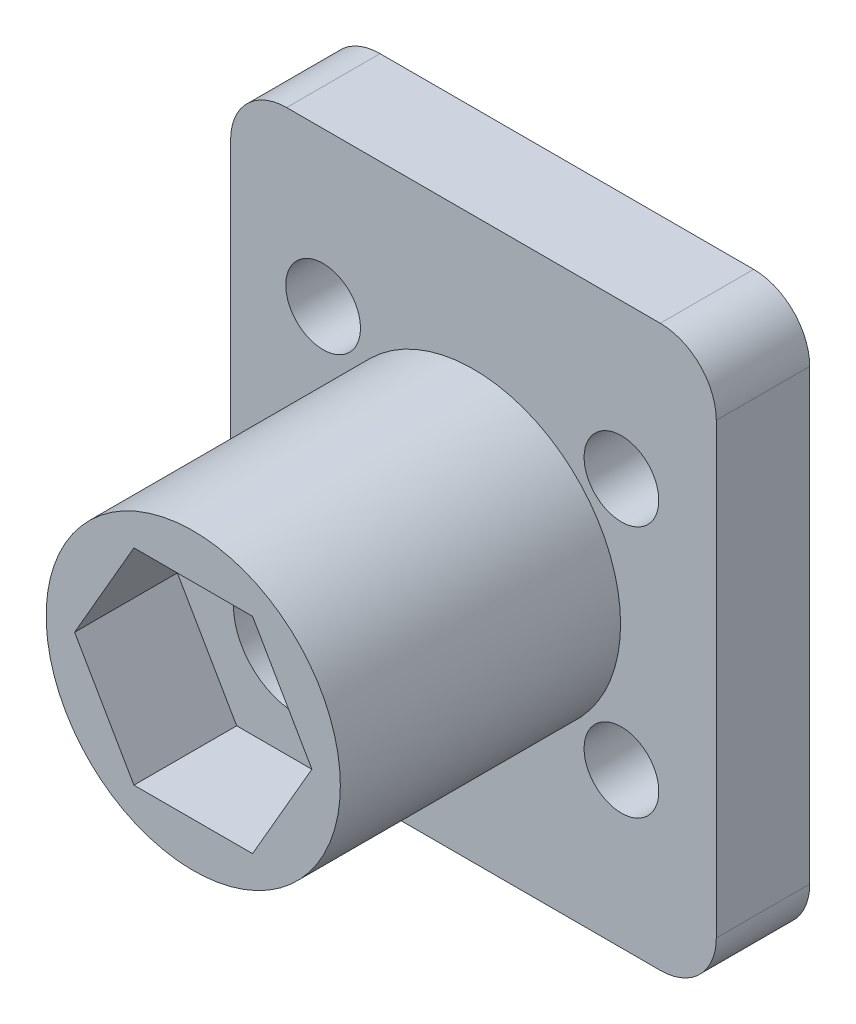
ISO-10303-21;
HEADER;
FILE_DESCRIPTION(('STEP AP214'),'2;1');
FILE_NAME('part.step','',(''),(''),'','','');
FILE_SCHEMA(('AUTOMOTIVE_DESIGN { 1 0 10303 214 1 1 1 1 }'));
ENDSEC;
DATA;
#1=APPLICATION_CONTEXT('core data for automotive mechanical design processes');
#2=APPLICATION_PROTOCOL_DEFINITION('international standard','automotive_design',2000,#1);
#3=PRODUCT_CONTEXT('',#1,'mechanical');
#4=PRODUCT('Part','Part','',(#3));
#5=PRODUCT_RELATED_PRODUCT_CATEGORY('part','',(#4));
#6=PRODUCT_DEFINITION_FORMATION('','',#4);
#7=PRODUCT_DEFINITION_CONTEXT('part definition',#1,'design');
#8=PRODUCT_DEFINITION('design','',#6,#7);
#9=PRODUCT_DEFINITION_SHAPE('','',#8);
#10=(LENGTH_UNIT() NAMED_UNIT(*) SI_UNIT(.MILLI.,.METRE.));
#11=(NAMED_UNIT(*) PLANE_ANGLE_UNIT() SI_UNIT($,.RADIAN.));
#12=(NAMED_UNIT(*) SI_UNIT($,.STERADIAN.) SOLID_ANGLE_UNIT());
#13=UNCERTAINTY_MEASURE_WITH_UNIT(LENGTH_MEASURE(1.E-05),#10,'distance_accuracy_value','');
#14=(GEOMETRIC_REPRESENTATION_CONTEXT(3) GLOBAL_UNCERTAINTY_ASSIGNED_CONTEXT((#13)) GLOBAL_UNIT_ASSIGNED_CONTEXT((#10,
#11,#12)) REPRESENTATION_CONTEXT('',''));
#15=CARTESIAN_POINT('',(0.,0.,0.));
#16=DIRECTION('',(0.,0.,1.));
#17=DIRECTION('',(1.,0.,0.));
#18=AXIS2_PLACEMENT_3D('',#15,#16,#17);
#19=CARTESIAN_POINT('',(0.,0.,15.));
#20=DIRECTION('',(0.,0.,1.));
#21=DIRECTION('',(1.,0.,0.));
#22=AXIS2_PLACEMENT_3D('',#19,#20,#21);
#23=PLANE('',#22);
#24=CARTESIAN_POINT('',(0.,0.,15.));
#25=DIRECTION('',(0.,0.,1.));
#26=DIRECTION('',(1.,0.,0.));
#27=AXIS2_PLACEMENT_3D('',#24,#25,#26);
#28=CIRCLE('',#27,7.875);
#29=CARTESIAN_POINT('',(7.875,0.,15.));
#30=VERTEX_POINT('',#29);
#31=EDGE_CURVE('E222',#30,#30,#28,.T.);
#32=ORIENTED_EDGE('',*,*,#31,.T.);
#33=EDGE_LOOP('',(#32));
#34=FACE_BOUND('',#33,.T.);
#35=DIRECTION('',(-0.500000000000001,0.866025403784438,0.));
#36=VECTOR('',#35,1.);
#37=CARTESIAN_POINT('',(6.35085296108589,0.,15.));
#38=LINE('',#37,#36);
#39=CARTESIAN_POINT('',(6.35085296108589,0.,15.));
#40=VERTEX_POINT('',#39);
#41=CARTESIAN_POINT('',(3.17542648054293,5.50000000000001,15.));
#42=VERTEX_POINT('',#41);
#43=EDGE_CURVE('E201',#40,#42,#38,.T.);
#44=ORIENTED_EDGE('',*,*,#43,.F.);
#45=DIRECTION('',(0.499999999999995,0.866025403784441,0.));
#46=VECTOR('',#45,1.);
#47=CARTESIAN_POINT('',(3.17542648054301,-5.49999999999997,15.));
#48=LINE('',#47,#46);
#49=CARTESIAN_POINT('',(3.17542648054301,-5.49999999999997,15.));
#50=VERTEX_POINT('',#49);
#51=EDGE_CURVE('E199',#50,#40,#48,.T.);
#52=ORIENTED_EDGE('',*,*,#51,.F.);
#53=DIRECTION('',(1.,0.,0.));
#54=VECTOR('',#53,1.);
#55=CARTESIAN_POINT('',(-3.17542648054289,-5.50000000000003,15.));
#56=LINE('',#55,#54);
#57=CARTESIAN_POINT('',(-3.17542648054289,-5.50000000000003,15.));
#58=VERTEX_POINT('',#57);
#59=EDGE_CURVE('E146',#58,#50,#56,.T.);
#60=ORIENTED_EDGE('',*,*,#59,.F.);
#61=DIRECTION('',(0.500000000000007,-0.866025403784435,0.));
#62=VECTOR('',#61,1.);
#63=CARTESIAN_POINT('',(-6.35085296108589,0.,15.));
#64=LINE('',#63,#62);
#65=CARTESIAN_POINT('',(-6.35085296108589,0.,15.));
#66=VERTEX_POINT('',#65);
#67=EDGE_CURVE('E207',#66,#58,#64,.T.);
#68=ORIENTED_EDGE('',*,*,#67,.F.);
#69=DIRECTION('',(-0.499999999999995,-0.866025403784441,0.));
#70=VECTOR('',#69,1.);
#71=CARTESIAN_POINT('',(-3.17542648054297,5.49999999999999,15.));
#72=LINE('',#71,#70);
#73=CARTESIAN_POINT('',(-3.17542648054297,5.49999999999999,15.));
#74=VERTEX_POINT('',#73);
#75=EDGE_CURVE('E205',#74,#66,#72,.T.);
#76=ORIENTED_EDGE('',*,*,#75,.F.);
#77=DIRECTION('',(-1.,0.,0.));
#78=VECTOR('',#77,1.);
#79=CARTESIAN_POINT('',(3.17542648054293,5.50000000000001,15.));
#80=LINE('',#79,#78);
#81=EDGE_CURVE('E203',#42,#74,#80,.T.);
#82=ORIENTED_EDGE('',*,*,#81,.F.);
#83=EDGE_LOOP('',(#44,#52,#60,#68,#76,#82));
#84=FACE_BOUND('',#83,.T.);
#85=ADVANCED_FACE('F39',(#34,#84),#23,.T.);
#86=CARTESIAN_POINT('',(0.,0.,15.));
#87=DIRECTION('',(0.,0.,-1.));
#88=DIRECTION('',(-1.,0.,0.));
#89=AXIS2_PLACEMENT_3D('',#86,#87,#88);
#90=CYLINDRICAL_SURFACE('',#89,7.875);
#91=ORIENTED_EDGE('',*,*,#31,.F.);
#92=EDGE_LOOP('',(#91));
#93=FACE_BOUND('',#92,.T.);
#94=CARTESIAN_POINT('',(0.,0.,0.));
#95=DIRECTION('',(0.,0.,1.));
#96=DIRECTION('',(1.,0.,0.));
#97=AXIS2_PLACEMENT_3D('',#94,#95,#96);
#98=CIRCLE('',#97,7.875);
#99=CARTESIAN_POINT('',(7.875,0.,0.));
#100=VERTEX_POINT('',#99);
#101=EDGE_CURVE('E189',#100,#100,#98,.T.);
#102=ORIENTED_EDGE('',*,*,#101,.T.);
#103=EDGE_LOOP('',(#102));
#104=FACE_BOUND('',#103,.T.);
#105=ADVANCED_FACE('F310',(#93,#104),#90,.T.);
#106=CARTESIAN_POINT('',(3.17542648054301,-5.49999999999997,15.));
#107=DIRECTION('',(-0.866025403784441,0.499999999999995,0.));
#108=DIRECTION('',(-0.499999999999995,-0.866025403784441,0.));
#109=AXIS2_PLACEMENT_3D('',#106,#107,#108);
#110=PLANE('',#109);
#111=DIRECTION('',(0.499999999999995,0.866025403784442,0.));
#112=VECTOR('',#111,1.);
#113=CARTESIAN_POINT('',(3.17542648054301,-5.49999999999997,9.5));
#114=LINE('',#113,#112);
#115=CARTESIAN_POINT('',(3.17542648054301,-5.49999999999997,9.5));
#116=VERTEX_POINT('',#115);
#117=CARTESIAN_POINT('',(6.35085296108589,0.,9.5));
#118=VERTEX_POINT('',#117);
#119=EDGE_CURVE('E153',#116,#118,#114,.T.);
#120=ORIENTED_EDGE('',*,*,#119,.F.);
#121=DIRECTION('',(0.,0.,-1.));
#122=VECTOR('',#121,1.);
#123=CARTESIAN_POINT('',(3.17542648054301,-5.49999999999997,15.));
#124=LINE('',#123,#122);
#125=EDGE_CURVE('E139',#50,#116,#124,.T.);
#126=ORIENTED_EDGE('',*,*,#125,.F.);
#127=ORIENTED_EDGE('',*,*,#51,.T.);
#128=DIRECTION('',(0.,0.,-1.));
#129=VECTOR('',#128,1.);
#130=CARTESIAN_POINT('',(6.35085296108589,0.,15.));
#131=LINE('',#130,#129);
#132=EDGE_CURVE('E156',#40,#118,#131,.T.);
#133=ORIENTED_EDGE('',*,*,#132,.T.);
#134=EDGE_LOOP('',(#120,#126,#127,#133));
#135=FACE_BOUND('',#134,.T.);
#136=ADVANCED_FACE('F154',(#135),#110,.T.);
#137=CARTESIAN_POINT('',(6.35085296108589,0.,15.));
#138=DIRECTION('',(-0.866025403784438,-0.500000000000001,0.));
#139=DIRECTION('',(0.500000000000001,-0.866025403784438,0.));
#140=AXIS2_PLACEMENT_3D('',#137,#138,#139);
#141=PLANE('',#140);
#142=DIRECTION('',(-0.500000000000001,0.866025403784438,0.));
#143=VECTOR('',#142,1.);
#144=CARTESIAN_POINT('',(6.35085296108589,0.,9.5));
#145=LINE('',#144,#143);
#146=CARTESIAN_POINT('',(3.17542648054293,5.50000000000001,9.5));
#147=VERTEX_POINT('',#146);
#148=EDGE_CURVE('E159',#118,#147,#145,.T.);
#149=ORIENTED_EDGE('',*,*,#148,.F.);
#150=ORIENTED_EDGE('',*,*,#132,.F.);
#151=ORIENTED_EDGE('',*,*,#43,.T.);
#152=DIRECTION('',(0.,0.,-1.));
#153=VECTOR('',#152,1.);
#154=CARTESIAN_POINT('',(3.17542648054293,5.50000000000001,15.));
#155=LINE('',#154,#153);
#156=EDGE_CURVE('E218',#42,#147,#155,.T.);
#157=ORIENTED_EDGE('',*,*,#156,.T.);
#158=EDGE_LOOP('',(#149,#150,#151,#157));
#159=FACE_BOUND('',#158,.T.);
#160=ADVANCED_FACE('F444',(#159),#141,.T.);
#161=CARTESIAN_POINT('',(3.17542648054293,5.50000000000001,15.));
#162=DIRECTION('',(0.,-1.,0.));
#163=DIRECTION('',(1.,0.,0.));
#164=AXIS2_PLACEMENT_3D('',#161,#162,#163);
#165=PLANE('',#164);
#166=DIRECTION('',(-1.,0.,0.));
#167=VECTOR('',#166,1.);
#168=CARTESIAN_POINT('',(3.17542648054293,5.50000000000001,9.5));
#169=LINE('',#168,#167);
#170=CARTESIAN_POINT('',(-3.17542648054297,5.49999999999999,9.5));
#171=VERTEX_POINT('',#170);
#172=EDGE_CURVE('E172',#147,#171,#169,.T.);
#173=ORIENTED_EDGE('',*,*,#172,.F.);
#174=ORIENTED_EDGE('',*,*,#156,.F.);
#175=ORIENTED_EDGE('',*,*,#81,.T.);
#176=DIRECTION('',(0.,0.,-1.));
#177=VECTOR('',#176,1.);
#178=CARTESIAN_POINT('',(-3.17542648054297,5.49999999999999,15.));
#179=LINE('',#178,#177);
#180=EDGE_CURVE('E215',#74,#171,#179,.T.);
#181=ORIENTED_EDGE('',*,*,#180,.T.);
#182=EDGE_LOOP('',(#173,#174,#175,#181));
#183=FACE_BOUND('',#182,.T.);
#184=ADVANCED_FACE('F434',(#183),#165,.T.);
#185=CARTESIAN_POINT('',(-3.17542648054297,5.49999999999999,15.));
#186=DIRECTION('',(0.866025403784441,-0.499999999999995,0.));
#187=DIRECTION('',(0.499999999999995,0.866025403784442,0.));
#188=AXIS2_PLACEMENT_3D('',#185,#186,#187);
#189=PLANE('',#188);
#190=DIRECTION('',(-0.499999999999995,-0.866025403784441,0.));
#191=VECTOR('',#190,1.);
#192=CARTESIAN_POINT('',(-3.17542648054297,5.49999999999999,9.5));
#193=LINE('',#192,#191);
#194=CARTESIAN_POINT('',(-6.35085296108589,0.,9.5));
#195=VERTEX_POINT('',#194);
#196=EDGE_CURVE('E175',#171,#195,#193,.T.);
#197=ORIENTED_EDGE('',*,*,#196,.F.);
#198=ORIENTED_EDGE('',*,*,#180,.F.);
#199=ORIENTED_EDGE('',*,*,#75,.T.);
#200=DIRECTION('',(0.,0.,-1.));
#201=VECTOR('',#200,1.);
#202=CARTESIAN_POINT('',(-6.35085296108589,0.,15.));
#203=LINE('',#202,#201);
#204=EDGE_CURVE('E212',#66,#195,#203,.T.);
#205=ORIENTED_EDGE('',*,*,#204,.T.);
#206=EDGE_LOOP('',(#197,#198,#199,#205));
#207=FACE_BOUND('',#206,.T.);
#208=ADVANCED_FACE('F424',(#207),#189,.T.);
#209=CARTESIAN_POINT('',(-6.35085296108589,0.,15.));
#210=DIRECTION('',(0.866025403784435,0.500000000000007,0.));
#211=DIRECTION('',(-0.500000000000007,0.866025403784435,0.));
#212=AXIS2_PLACEMENT_3D('',#209,#210,#211);
#213=PLANE('',#212);
#214=DIRECTION('',(0.500000000000007,-0.866025403784435,0.));
#215=VECTOR('',#214,1.);
#216=CARTESIAN_POINT('',(-6.35085296108589,0.,9.5));
#217=LINE('',#216,#215);
#218=CARTESIAN_POINT('',(-3.17542648054289,-5.50000000000003,9.5));
#219=VERTEX_POINT('',#218);
#220=EDGE_CURVE('E165',#195,#219,#217,.T.);
#221=ORIENTED_EDGE('',*,*,#220,.F.);
#222=ORIENTED_EDGE('',*,*,#204,.F.);
#223=ORIENTED_EDGE('',*,*,#67,.T.);
#224=DIRECTION('',(0.,0.,-1.));
#225=VECTOR('',#224,1.);
#226=CARTESIAN_POINT('',(-3.17542648054289,-5.50000000000003,15.));
#227=LINE('',#226,#225);
#228=EDGE_CURVE('E149',#58,#219,#227,.T.);
#229=ORIENTED_EDGE('',*,*,#228,.T.);
#230=EDGE_LOOP('',(#221,#222,#223,#229));
#231=FACE_BOUND('',#230,.T.);
#232=ADVANCED_FACE('F413',(#231),#213,.T.);
#233=CARTESIAN_POINT('',(-3.17542648054289,-5.50000000000003,15.));
#234=DIRECTION('',(0.,1.,0.));
#235=DIRECTION('',(-1.,0.,0.));
#236=AXIS2_PLACEMENT_3D('',#233,#234,#235);
#237=PLANE('',#236);
#238=DIRECTION('',(1.,0.,0.));
#239=VECTOR('',#238,1.);
#240=CARTESIAN_POINT('',(-3.17542648054289,-5.50000000000003,9.5));
#241=LINE('',#240,#239);
#242=EDGE_CURVE('E143',#219,#116,#241,.T.);
#243=ORIENTED_EDGE('',*,*,#242,.F.);
#244=ORIENTED_EDGE('',*,*,#228,.F.);
#245=ORIENTED_EDGE('',*,*,#59,.T.);
#246=ORIENTED_EDGE('',*,*,#125,.T.);
#247=EDGE_LOOP('',(#243,#244,#245,#246));
#248=FACE_BOUND('',#247,.T.);
#249=ADVANCED_FACE('F141',(#248),#237,.T.);
#250=CARTESIAN_POINT('',(-13.,15.,-5.));
#251=DIRECTION('',(1.,0.,0.));
#252=DIRECTION('',(0.,0.,-1.));
#253=AXIS2_PLACEMENT_3D('',#250,#251,#252);
#254=PLANE('',#253);
#255=DIRECTION('',(0.,1.,0.));
#256=VECTOR('',#255,1.);
#257=CARTESIAN_POINT('',(-13.,15.,-5.));
#258=LINE('',#257,#256);
#259=CARTESIAN_POINT('',(-13.,-12.,-5.));
#260=VERTEX_POINT('',#259);
#261=CARTESIAN_POINT('',(-13.,12.,-5.));
#262=VERTEX_POINT('',#261);
#263=EDGE_CURVE('E178',#260,#262,#258,.T.);
#264=ORIENTED_EDGE('',*,*,#263,.F.);
#265=DIRECTION('',(0.,0.,1.));
#266=VECTOR('',#265,1.);
#267=CARTESIAN_POINT('',(-13.,-12.,-5.));
#268=LINE('',#267,#266);
#269=CARTESIAN_POINT('',(-13.,-12.,0.));
#270=VERTEX_POINT('',#269);
#271=EDGE_CURVE('E268',#260,#270,#268,.T.);
#272=ORIENTED_EDGE('',*,*,#271,.T.);
#273=DIRECTION('',(0.,1.,0.));
#274=VECTOR('',#273,1.);
#275=CARTESIAN_POINT('',(-13.,15.,0.));
#276=LINE('',#275,#274);
#277=CARTESIAN_POINT('',(-13.,12.,0.));
#278=VERTEX_POINT('',#277);
#279=EDGE_CURVE('E177',#270,#278,#276,.T.);
#280=ORIENTED_EDGE('',*,*,#279,.T.);
#281=DIRECTION('',(0.,0.,1.));
#282=VECTOR('',#281,1.);
#283=CARTESIAN_POINT('',(-13.,12.,-5.));
#284=LINE('',#283,#282);
#285=EDGE_CURVE('E266',#278,#262,#284,.F.);
#286=ORIENTED_EDGE('',*,*,#285,.T.);
#287=EDGE_LOOP('',(#264,#272,#280,#286));
#288=FACE_BOUND('',#287,.T.);
#289=ADVANCED_FACE('F285',(#288),#254,.F.);
#290=CARTESIAN_POINT('',(13.,15.,-5.));
#291=DIRECTION('',(0.,-1.,0.));
#292=DIRECTION('',(0.,0.,-1.));
#293=AXIS2_PLACEMENT_3D('',#290,#291,#292);
#294=PLANE('',#293);
#295=DIRECTION('',(1.,0.,0.));
#296=VECTOR('',#295,1.);
#297=CARTESIAN_POINT('',(13.,15.,0.));
#298=LINE('',#297,#296);
#299=CARTESIAN_POINT('',(-9.99999999999999,15.,0.));
#300=VERTEX_POINT('',#299);
#301=CARTESIAN_POINT('',(10.,15.,0.));
#302=VERTEX_POINT('',#301);
#303=EDGE_CURVE('E192',#300,#302,#298,.T.);
#304=ORIENTED_EDGE('',*,*,#303,.T.);
#305=DIRECTION('',(0.,0.,1.));
#306=VECTOR('',#305,1.);
#307=CARTESIAN_POINT('',(10.,15.,-5.));
#308=LINE('',#307,#306);
#309=CARTESIAN_POINT('',(10.,15.,-5.));
#310=VERTEX_POINT('',#309);
#311=EDGE_CURVE('E257',#302,#310,#308,.F.);
#312=ORIENTED_EDGE('',*,*,#311,.T.);
#313=DIRECTION('',(1.,0.,0.));
#314=VECTOR('',#313,1.);
#315=CARTESIAN_POINT('',(13.,15.,-5.));
#316=LINE('',#315,#314);
#317=CARTESIAN_POINT('',(-9.99999999999999,15.,-5.));
#318=VERTEX_POINT('',#317);
#319=EDGE_CURVE('E181',#318,#310,#316,.T.);
#320=ORIENTED_EDGE('',*,*,#319,.F.);
#321=DIRECTION('',(0.,0.,1.));
#322=VECTOR('',#321,1.);
#323=CARTESIAN_POINT('',(-10.,15.,-5.));
#324=LINE('',#323,#322);
#325=EDGE_CURVE('E254',#318,#300,#324,.T.);
#326=ORIENTED_EDGE('',*,*,#325,.T.);
#327=EDGE_LOOP('',(#304,#312,#320,#326));
#328=FACE_BOUND('',#327,.T.);
#329=ADVANCED_FACE('F295',(#328),#294,.F.);
#330=CARTESIAN_POINT('',(13.,15.,-5.));
#331=DIRECTION('',(-1.,0.,0.));
#332=DIRECTION('',(0.,0.,1.));
#333=AXIS2_PLACEMENT_3D('',#330,#331,#332);
#334=PLANE('',#333);
#335=DIRECTION('',(0.,-1.,0.));
#336=VECTOR('',#335,1.);
#337=CARTESIAN_POINT('',(13.,15.,-5.));
#338=LINE('',#337,#336);
#339=CARTESIAN_POINT('',(13.,12.,-5.));
#340=VERTEX_POINT('',#339);
#341=CARTESIAN_POINT('',(13.,-12.,-5.));
#342=VERTEX_POINT('',#341);
#343=EDGE_CURVE('E185',#340,#342,#338,.T.);
#344=ORIENTED_EDGE('',*,*,#343,.F.);
#345=DIRECTION('',(0.,0.,1.));
#346=VECTOR('',#345,1.);
#347=CARTESIAN_POINT('',(13.,12.,-5.));
#348=LINE('',#347,#346);
#349=CARTESIAN_POINT('',(13.,12.,0.));
#350=VERTEX_POINT('',#349);
#351=EDGE_CURVE('E243',#340,#350,#348,.T.);
#352=ORIENTED_EDGE('',*,*,#351,.T.);
#353=DIRECTION('',(0.,-1.,0.));
#354=VECTOR('',#353,1.);
#355=CARTESIAN_POINT('',(13.,15.,0.));
#356=LINE('',#355,#354);
#357=CARTESIAN_POINT('',(13.,-12.,0.));
#358=VERTEX_POINT('',#357);
#359=EDGE_CURVE('E195',#350,#358,#356,.T.);
#360=ORIENTED_EDGE('',*,*,#359,.T.);
#361=DIRECTION('',(0.,0.,1.));
#362=VECTOR('',#361,1.);
#363=CARTESIAN_POINT('',(13.,-12.,-5.));
#364=LINE('',#363,#362);
#365=EDGE_CURVE('E225',#358,#342,#364,.F.);
#366=ORIENTED_EDGE('',*,*,#365,.T.);
#367=EDGE_LOOP('',(#344,#352,#360,#366));
#368=FACE_BOUND('',#367,.T.);
#369=ADVANCED_FACE('F303',(#368),#334,.F.);
#370=CARTESIAN_POINT('',(13.,-15.,-5.));
#371=DIRECTION('',(0.,1.,0.));
#372=DIRECTION('',(-1.,0.,0.));
#373=AXIS2_PLACEMENT_3D('',#370,#371,#372);
#374=PLANE('',#373);
#375=DIRECTION('',(-1.,0.,0.));
#376=VECTOR('',#375,1.);
#377=CARTESIAN_POINT('',(13.,-15.,0.));
#378=LINE('',#377,#376);
#379=CARTESIAN_POINT('',(10.,-15.,0.));
#380=VERTEX_POINT('',#379);
#381=CARTESIAN_POINT('',(-9.99999999999999,-15.,0.));
#382=VERTEX_POINT('',#381);
#383=EDGE_CURVE('E182',#380,#382,#378,.T.);
#384=ORIENTED_EDGE('',*,*,#383,.T.);
#385=DIRECTION('',(0.,0.,1.));
#386=VECTOR('',#385,1.);
#387=CARTESIAN_POINT('',(-10.,-15.,-5.));
#388=LINE('',#387,#386);
#389=CARTESIAN_POINT('',(-9.99999999999999,-15.,-5.));
#390=VERTEX_POINT('',#389);
#391=EDGE_CURVE('E11',#382,#390,#388,.F.);
#392=ORIENTED_EDGE('',*,*,#391,.T.);
#393=DIRECTION('',(-1.,0.,0.));
#394=VECTOR('',#393,1.);
#395=CARTESIAN_POINT('',(13.,-15.,-5.));
#396=LINE('',#395,#394);
#397=CARTESIAN_POINT('',(10.,-15.,-5.));
#398=VERTEX_POINT('',#397);
#399=EDGE_CURVE('E187',#398,#390,#396,.T.);
#400=ORIENTED_EDGE('',*,*,#399,.F.);
#401=DIRECTION('',(0.,0.,1.));
#402=VECTOR('',#401,1.);
#403=CARTESIAN_POINT('',(10.,-15.,-5.));
#404=LINE('',#403,#402);
#405=EDGE_CURVE('E47',#398,#380,#404,.T.);
#406=ORIENTED_EDGE('',*,*,#405,.T.);
#407=EDGE_LOOP('',(#384,#392,#400,#406));
#408=FACE_BOUND('',#407,.T.);
#409=ADVANCED_FACE('F273',(#408),#374,.F.);
#410=CARTESIAN_POINT('',(0.,0.,-5.));
#411=DIRECTION('',(0.,0.,-1.));
#412=DIRECTION('',(-1.,0.,0.));
#413=AXIS2_PLACEMENT_3D('',#410,#411,#412);
#414=PLANE('',#413);
#415=CARTESIAN_POINT('',(-8.04749109633995,6.75,-5.));
#416=DIRECTION('',(0.,0.,-1.));
#417=DIRECTION('',(-1.,0.,0.));
#418=AXIS2_PLACEMENT_3D('',#415,#416,#417);
#419=CIRCLE('',#418,2.);
#420=CARTESIAN_POINT('',(-10.04749109634,6.75,-5.));
#421=VERTEX_POINT('',#420);
#422=EDGE_CURVE('E491',#421,#421,#419,.T.);
#423=ORIENTED_EDGE('',*,*,#422,.F.);
#424=EDGE_LOOP('',(#423));
#425=FACE_BOUND('',#424,.T.);
#426=CARTESIAN_POINT('',(-8.04749109633995,-6.75,-5.));
#427=DIRECTION('',(0.,0.,-1.));
#428=DIRECTION('',(-1.,0.,0.));
#429=AXIS2_PLACEMENT_3D('',#426,#427,#428);
#430=CIRCLE('',#429,2.);
#431=CARTESIAN_POINT('',(-10.04749109634,-6.75,-5.));
#432=VERTEX_POINT('',#431);
#433=EDGE_CURVE('E495',#432,#432,#430,.T.);
#434=ORIENTED_EDGE('',*,*,#433,.F.);
#435=EDGE_LOOP('',(#434));
#436=FACE_BOUND('',#435,.T.);
#437=CARTESIAN_POINT('',(7.92174904795963,-6.75,-5.));
#438=DIRECTION('',(0.,0.,-1.));
#439=DIRECTION('',(-1.,0.,0.));
#440=AXIS2_PLACEMENT_3D('',#437,#438,#439);
#441=CIRCLE('',#440,2.);
#442=CARTESIAN_POINT('',(5.92174904795963,-6.75,-5.));
#443=VERTEX_POINT('',#442);
#444=EDGE_CURVE('E499',#443,#443,#441,.T.);
#445=ORIENTED_EDGE('',*,*,#444,.F.);
#446=EDGE_LOOP('',(#445));
#447=FACE_BOUND('',#446,.T.);
#448=CARTESIAN_POINT('',(7.92174904795963,6.75,-5.));
#449=DIRECTION('',(0.,0.,-1.));
#450=DIRECTION('',(-1.,0.,0.));
#451=AXIS2_PLACEMENT_3D('',#448,#449,#450);
#452=CIRCLE('',#451,2.);
#453=CARTESIAN_POINT('',(5.92174904795963,6.75,-5.));
#454=VERTEX_POINT('',#453);
#455=EDGE_CURVE('E232',#454,#454,#452,.T.);
#456=ORIENTED_EDGE('',*,*,#455,.F.);
#457=EDGE_LOOP('',(#456));
#458=FACE_BOUND('',#457,.T.);
#459=CARTESIAN_POINT('',(0.,0.,-5.));
#460=DIRECTION('',(0.,0.,-1.));
#461=DIRECTION('',(-1.,0.,0.));
#462=AXIS2_PLACEMENT_3D('',#459,#460,#461);
#463=CIRCLE('',#462,3.35);
#464=CARTESIAN_POINT('',(-3.35,0.,-5.));
#465=VERTEX_POINT('',#464);
#466=EDGE_CURVE('E241',#465,#465,#463,.T.);
#467=ORIENTED_EDGE('',*,*,#466,.F.);
#468=EDGE_LOOP('',(#467));
#469=FACE_BOUND('',#468,.T.);
#470=ORIENTED_EDGE('',*,*,#319,.T.);
#471=CARTESIAN_POINT('',(10.,12.,-5.));
#472=DIRECTION('',(0.,0.,-1.));
#473=DIRECTION('',(-1.,0.,0.));
#474=AXIS2_PLACEMENT_3D('',#471,#472,#473);
#475=CIRCLE('',#474,3.);
#476=EDGE_CURVE('E264',#310,#340,#475,.T.);
#477=ORIENTED_EDGE('',*,*,#476,.T.);
#478=ORIENTED_EDGE('',*,*,#343,.T.);
#479=CARTESIAN_POINT('',(10.,-12.,-5.));
#480=DIRECTION('',(0.,0.,-1.));
#481=DIRECTION('',(-1.,0.,0.));
#482=AXIS2_PLACEMENT_3D('',#479,#480,#481);
#483=CIRCLE('',#482,3.);
#484=EDGE_CURVE('E59',#342,#398,#483,.T.);
#485=ORIENTED_EDGE('',*,*,#484,.T.);
#486=ORIENTED_EDGE('',*,*,#399,.T.);
#487=CARTESIAN_POINT('',(-10.,-12.,-5.));
#488=DIRECTION('',(0.,0.,-1.));
#489=DIRECTION('',(-1.,0.,0.));
#490=AXIS2_PLACEMENT_3D('',#487,#488,#489);
#491=CIRCLE('',#490,3.);
#492=EDGE_CURVE('E262',#390,#260,#491,.T.);
#493=ORIENTED_EDGE('',*,*,#492,.T.);
#494=ORIENTED_EDGE('',*,*,#263,.T.);
#495=CARTESIAN_POINT('',(-10.,12.,-5.));
#496=DIRECTION('',(0.,0.,-1.));
#497=DIRECTION('',(-1.,0.,0.));
#498=AXIS2_PLACEMENT_3D('',#495,#496,#497);
#499=CIRCLE('',#498,3.);
#500=EDGE_CURVE('E260',#262,#318,#499,.T.);
#501=ORIENTED_EDGE('',*,*,#500,.T.);
#502=EDGE_LOOP('',(#470,#477,#478,#485,#486,#493,#494,#501));
#503=FACE_BOUND('',#502,.T.);
#504=ADVANCED_FACE('F288',(#425,#436,#447,#458,#469,#503),#414,.T.);
#505=CARTESIAN_POINT('',(0.,0.,0.));
#506=DIRECTION('',(0.,0.,-1.));
#507=DIRECTION('',(-1.,0.,0.));
#508=AXIS2_PLACEMENT_3D('',#505,#506,#507);
#509=PLANE('',#508);
#510=CARTESIAN_POINT('',(-8.04749109633995,6.75,0.));
#511=DIRECTION('',(0.,0.,-1.));
#512=DIRECTION('',(-1.,0.,0.));
#513=AXIS2_PLACEMENT_3D('',#510,#511,#512);
#514=CIRCLE('',#513,2.);
#515=CARTESIAN_POINT('',(-10.04749109634,6.75,0.));
#516=VERTEX_POINT('',#515);
#517=EDGE_CURVE('E238',#516,#516,#514,.T.);
#518=ORIENTED_EDGE('',*,*,#517,.T.);
#519=EDGE_LOOP('',(#518));
#520=FACE_BOUND('',#519,.T.);
#521=CARTESIAN_POINT('',(-8.04749109633995,-6.75,0.));
#522=DIRECTION('',(0.,0.,-1.));
#523=DIRECTION('',(-1.,0.,0.));
#524=AXIS2_PLACEMENT_3D('',#521,#522,#523);
#525=CIRCLE('',#524,2.);
#526=CARTESIAN_POINT('',(-10.04749109634,-6.75,0.));
#527=VERTEX_POINT('',#526);
#528=EDGE_CURVE('E235',#527,#527,#525,.T.);
#529=ORIENTED_EDGE('',*,*,#528,.T.);
#530=EDGE_LOOP('',(#529));
#531=FACE_BOUND('',#530,.T.);
#532=CARTESIAN_POINT('',(7.92174904795963,-6.75,0.));
#533=DIRECTION('',(0.,0.,-1.));
#534=DIRECTION('',(-1.,0.,0.));
#535=AXIS2_PLACEMENT_3D('',#532,#533,#534);
#536=CIRCLE('',#535,2.);
#537=CARTESIAN_POINT('',(5.92174904795963,-6.75,0.));
#538=VERTEX_POINT('',#537);
#539=EDGE_CURVE('E231',#538,#538,#536,.T.);
#540=ORIENTED_EDGE('',*,*,#539,.T.);
#541=EDGE_LOOP('',(#540));
#542=FACE_BOUND('',#541,.T.);
#543=CARTESIAN_POINT('',(7.92174904795963,6.75,0.));
#544=DIRECTION('',(0.,0.,-1.));
#545=DIRECTION('',(-1.,0.,0.));
#546=AXIS2_PLACEMENT_3D('',#543,#544,#545);
#547=CIRCLE('',#546,2.);
#548=CARTESIAN_POINT('',(5.92174904795963,6.75,0.));
#549=VERTEX_POINT('',#548);
#550=EDGE_CURVE('E228',#549,#549,#547,.T.);
#551=ORIENTED_EDGE('',*,*,#550,.T.);
#552=EDGE_LOOP('',(#551));
#553=FACE_BOUND('',#552,.T.);
#554=ORIENTED_EDGE('',*,*,#101,.F.);
#555=EDGE_LOOP('',(#554));
#556=FACE_BOUND('',#555,.T.);
#557=ORIENTED_EDGE('',*,*,#359,.F.);
#558=CARTESIAN_POINT('',(10.,12.,0.));
#559=DIRECTION('',(0.,0.,-1.));
#560=DIRECTION('',(-1.,0.,0.));
#561=AXIS2_PLACEMENT_3D('',#558,#559,#560);
#562=CIRCLE('',#561,3.);
#563=EDGE_CURVE('E252',#350,#302,#562,.F.);
#564=ORIENTED_EDGE('',*,*,#563,.T.);
#565=ORIENTED_EDGE('',*,*,#303,.F.);
#566=CARTESIAN_POINT('',(-10.,12.,0.));
#567=DIRECTION('',(0.,0.,-1.));
#568=DIRECTION('',(-1.,0.,0.));
#569=AXIS2_PLACEMENT_3D('',#566,#567,#568);
#570=CIRCLE('',#569,3.);
#571=EDGE_CURVE('E248',#300,#278,#570,.F.);
#572=ORIENTED_EDGE('',*,*,#571,.T.);
#573=ORIENTED_EDGE('',*,*,#279,.F.);
#574=CARTESIAN_POINT('',(-10.,-12.,0.));
#575=DIRECTION('',(0.,0.,-1.));
#576=DIRECTION('',(-1.,0.,0.));
#577=AXIS2_PLACEMENT_3D('',#574,#575,#576);
#578=CIRCLE('',#577,3.);
#579=EDGE_CURVE('E250',#270,#382,#578,.F.);
#580=ORIENTED_EDGE('',*,*,#579,.T.);
#581=ORIENTED_EDGE('',*,*,#383,.F.);
#582=CARTESIAN_POINT('',(10.,-12.,0.));
#583=DIRECTION('',(0.,0.,-1.));
#584=DIRECTION('',(-1.,0.,0.));
#585=AXIS2_PLACEMENT_3D('',#582,#583,#584);
#586=CIRCLE('',#585,3.);
#587=EDGE_CURVE('E246',#380,#358,#586,.F.);
#588=ORIENTED_EDGE('',*,*,#587,.T.);
#589=EDGE_LOOP('',(#557,#564,#565,#572,#573,#580,#581,#588));
#590=FACE_BOUND('',#589,.T.);
#591=ADVANCED_FACE('F277',(#520,#531,#542,#553,#556,#590),#509,.F.);
#592=CARTESIAN_POINT('',(0.,0.,9.5));
#593=DIRECTION('',(0.,0.,1.));
#594=DIRECTION('',(1.,0.,0.));
#595=AXIS2_PLACEMENT_3D('',#592,#593,#594);
#596=PLANE('',#595);
#597=ORIENTED_EDGE('',*,*,#220,.T.);
#598=ORIENTED_EDGE('',*,*,#242,.T.);
#599=ORIENTED_EDGE('',*,*,#119,.T.);
#600=ORIENTED_EDGE('',*,*,#148,.T.);
#601=ORIENTED_EDGE('',*,*,#172,.T.);
#602=ORIENTED_EDGE('',*,*,#196,.T.);
#603=EDGE_LOOP('',(#597,#598,#599,#600,#601,#602));
#604=FACE_BOUND('',#603,.T.);
#605=CARTESIAN_POINT('',(0.,0.,9.5));
#606=DIRECTION('',(0.,0.,1.));
#607=DIRECTION('',(1.,0.,0.));
#608=AXIS2_PLACEMENT_3D('',#605,#606,#607);
#609=CIRCLE('',#608,3.35);
#610=CARTESIAN_POINT('',(3.35,0.,9.5));
#611=VERTEX_POINT('',#610);
#612=EDGE_CURVE('E167',#611,#611,#609,.T.);
#613=ORIENTED_EDGE('',*,*,#612,.F.);
#614=EDGE_LOOP('',(#613));
#615=FACE_BOUND('',#614,.T.);
#616=ADVANCED_FACE('F162',(#604,#615),#596,.T.);
#617=CARTESIAN_POINT('',(0.,0.,9.5));
#618=DIRECTION('',(0.,0.,-1.));
#619=DIRECTION('',(-1.,0.,0.));
#620=AXIS2_PLACEMENT_3D('',#617,#618,#619);
#621=CYLINDRICAL_SURFACE('',#620,3.35);
#622=ORIENTED_EDGE('',*,*,#612,.T.);
#623=EDGE_LOOP('',(#622));
#624=FACE_BOUND('',#623,.T.);
#625=ORIENTED_EDGE('',*,*,#466,.T.);
#626=EDGE_LOOP('',(#625));
#627=FACE_BOUND('',#626,.T.);
#628=ADVANCED_FACE('F383',(#624,#627),#621,.F.);
#629=CARTESIAN_POINT('',(7.92174904795963,6.75,4.5));
#630=DIRECTION('',(0.,0.,-1.));
#631=DIRECTION('',(-1.,0.,0.));
#632=AXIS2_PLACEMENT_3D('',#629,#630,#631);
#633=CYLINDRICAL_SURFACE('',#632,2.);
#634=ORIENTED_EDGE('',*,*,#455,.T.);
#635=EDGE_LOOP('',(#634));
#636=FACE_BOUND('',#635,.T.);
#637=ORIENTED_EDGE('',*,*,#550,.F.);
#638=EDGE_LOOP('',(#637));
#639=FACE_BOUND('',#638,.T.);
#640=ADVANCED_FACE('F374',(#636,#639),#633,.F.);
#641=CARTESIAN_POINT('',(7.92174904795963,-6.75,4.5));
#642=DIRECTION('',(0.,0.,-1.));
#643=DIRECTION('',(-1.,0.,0.));
#644=AXIS2_PLACEMENT_3D('',#641,#642,#643);
#645=CYLINDRICAL_SURFACE('',#644,2.);
#646=ORIENTED_EDGE('',*,*,#444,.T.);
#647=EDGE_LOOP('',(#646));
#648=FACE_BOUND('',#647,.T.);
#649=ORIENTED_EDGE('',*,*,#539,.F.);
#650=EDGE_LOOP('',(#649));
#651=FACE_BOUND('',#650,.T.);
#652=ADVANCED_FACE('F365',(#648,#651),#645,.F.);
#653=CARTESIAN_POINT('',(-8.04749109633995,-6.75,4.5));
#654=DIRECTION('',(0.,0.,-1.));
#655=DIRECTION('',(-1.,0.,0.));
#656=AXIS2_PLACEMENT_3D('',#653,#654,#655);
#657=CYLINDRICAL_SURFACE('',#656,2.);
#658=ORIENTED_EDGE('',*,*,#433,.T.);
#659=EDGE_LOOP('',(#658));
#660=FACE_BOUND('',#659,.T.);
#661=ORIENTED_EDGE('',*,*,#528,.F.);
#662=EDGE_LOOP('',(#661));
#663=FACE_BOUND('',#662,.T.);
#664=ADVANCED_FACE('F355',(#660,#663),#657,.F.);
#665=CARTESIAN_POINT('',(-8.04749109633995,6.75,4.5));
#666=DIRECTION('',(0.,0.,-1.));
#667=DIRECTION('',(-1.,0.,0.));
#668=AXIS2_PLACEMENT_3D('',#665,#666,#667);
#669=CYLINDRICAL_SURFACE('',#668,2.);
#670=ORIENTED_EDGE('',*,*,#422,.T.);
#671=EDGE_LOOP('',(#670));
#672=FACE_BOUND('',#671,.T.);
#673=ORIENTED_EDGE('',*,*,#517,.F.);
#674=EDGE_LOOP('',(#673));
#675=FACE_BOUND('',#674,.T.);
#676=ADVANCED_FACE('F324',(#672,#675),#669,.F.);
#677=CARTESIAN_POINT('',(10.,12.,-5.));
#678=DIRECTION('',(0.,0.,1.));
#679=DIRECTION('',(1.,0.,0.));
#680=AXIS2_PLACEMENT_3D('',#677,#678,#679);
#681=CYLINDRICAL_SURFACE('',#680,3.);
#682=ORIENTED_EDGE('',*,*,#476,.F.);
#683=ORIENTED_EDGE('',*,*,#311,.F.);
#684=ORIENTED_EDGE('',*,*,#563,.F.);
#685=ORIENTED_EDGE('',*,*,#351,.F.);
#686=EDGE_LOOP('',(#682,#683,#684,#685));
#687=FACE_BOUND('',#686,.T.);
#688=ADVANCED_FACE('F300',(#687),#681,.T.);
#689=CARTESIAN_POINT('',(-10.,-12.,-5.));
#690=DIRECTION('',(0.,0.,1.));
#691=DIRECTION('',(1.,0.,0.));
#692=AXIS2_PLACEMENT_3D('',#689,#690,#691);
#693=CYLINDRICAL_SURFACE('',#692,3.);
#694=ORIENTED_EDGE('',*,*,#492,.F.);
#695=ORIENTED_EDGE('',*,*,#391,.F.);
#696=ORIENTED_EDGE('',*,*,#579,.F.);
#697=ORIENTED_EDGE('',*,*,#271,.F.);
#698=EDGE_LOOP('',(#694,#695,#696,#697));
#699=FACE_BOUND('',#698,.T.);
#700=ADVANCED_FACE('F282',(#699),#693,.T.);
#701=CARTESIAN_POINT('',(-10.,12.,-5.));
#702=DIRECTION('',(0.,0.,1.));
#703=DIRECTION('',(1.,0.,0.));
#704=AXIS2_PLACEMENT_3D('',#701,#702,#703);
#705=CYLINDRICAL_SURFACE('',#704,3.);
#706=ORIENTED_EDGE('',*,*,#500,.F.);
#707=ORIENTED_EDGE('',*,*,#285,.F.);
#708=ORIENTED_EDGE('',*,*,#571,.F.);
#709=ORIENTED_EDGE('',*,*,#325,.F.);
#710=EDGE_LOOP('',(#706,#707,#708,#709));
#711=FACE_BOUND('',#710,.T.);
#712=ADVANCED_FACE('F292',(#711),#705,.T.);
#713=CARTESIAN_POINT('',(10.,-12.,-5.));
#714=DIRECTION('',(0.,0.,1.));
#715=DIRECTION('',(1.,0.,0.));
#716=AXIS2_PLACEMENT_3D('',#713,#714,#715);
#717=CYLINDRICAL_SURFACE('',#716,3.);
#718=ORIENTED_EDGE('',*,*,#484,.F.);
#719=ORIENTED_EDGE('',*,*,#365,.F.);
#720=ORIENTED_EDGE('',*,*,#587,.F.);
#721=ORIENTED_EDGE('',*,*,#405,.F.);
#722=EDGE_LOOP('',(#718,#719,#720,#721));
#723=FACE_BOUND('',#722,.T.);
#724=ADVANCED_FACE('F41',(#723),#717,.T.);
#725=CLOSED_SHELL('',(#85,#105,#136,#160,#184,#208,#232,#249,#289,#329,#369,#409,#504,#591,#616,
#628,#640,#652,#664,#676,#688,#700,#712,#724));
#726=MANIFOLD_SOLID_BREP('B2',#725);
#727=ADVANCED_BREP_SHAPE_REPRESENTATION('',(#18,#726),#14);
#728=SHAPE_DEFINITION_REPRESENTATION(#9,#727);
ENDSEC;
END-ISO-10303-21;
